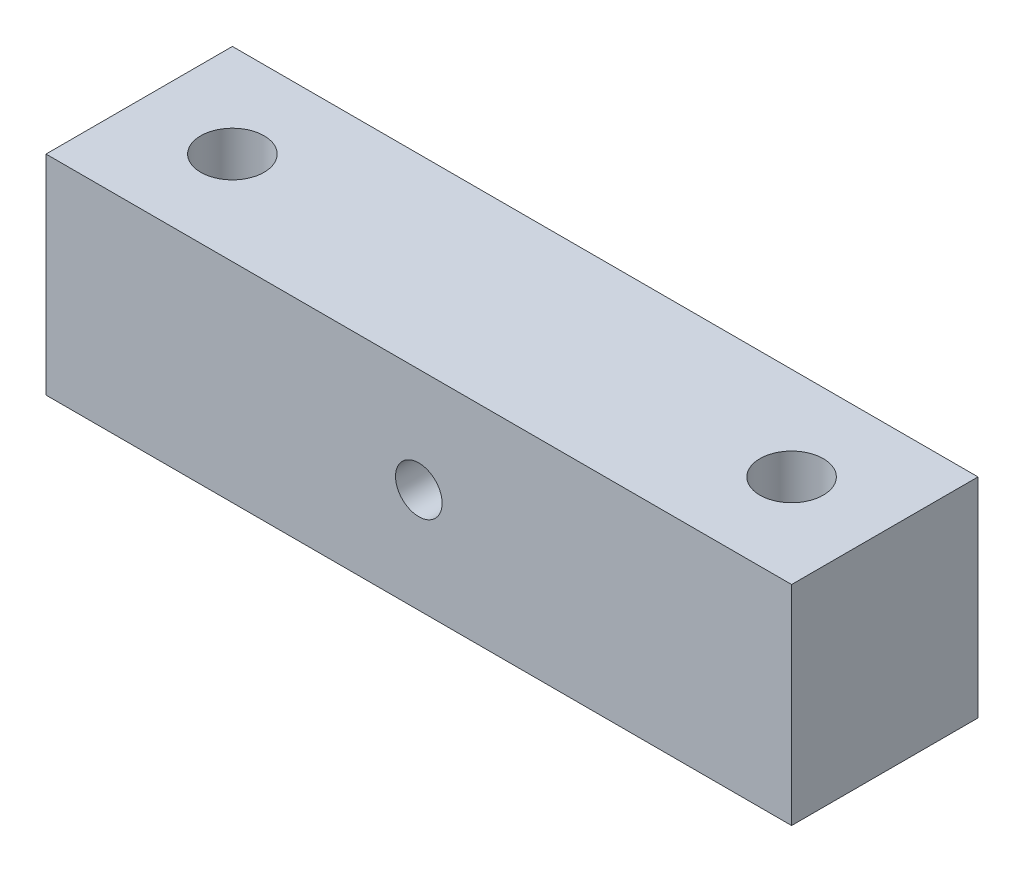
ISO-10303-21;
HEADER;
FILE_DESCRIPTION(('STEP AP214'),'2;1');
FILE_NAME('part.step','',(''),(''),'','','');
FILE_SCHEMA(('AUTOMOTIVE_DESIGN { 1 0 10303 214 1 1 1 1 }'));
ENDSEC;
DATA;
#1=APPLICATION_CONTEXT('core data for automotive mechanical design processes');
#2=APPLICATION_PROTOCOL_DEFINITION('international standard','automotive_design',2000,#1);
#3=PRODUCT_CONTEXT('',#1,'mechanical');
#4=PRODUCT('Part','Part','',(#3));
#5=PRODUCT_RELATED_PRODUCT_CATEGORY('part','',(#4));
#6=PRODUCT_DEFINITION_FORMATION('','',#4);
#7=PRODUCT_DEFINITION_CONTEXT('part definition',#1,'design');
#8=PRODUCT_DEFINITION('design','',#6,#7);
#9=PRODUCT_DEFINITION_SHAPE('','',#8);
#10=(LENGTH_UNIT() NAMED_UNIT(*) SI_UNIT(.MILLI.,.METRE.));
#11=(NAMED_UNIT(*) PLANE_ANGLE_UNIT() SI_UNIT($,.RADIAN.));
#12=(NAMED_UNIT(*) SI_UNIT($,.STERADIAN.) SOLID_ANGLE_UNIT());
#13=UNCERTAINTY_MEASURE_WITH_UNIT(LENGTH_MEASURE(1.E-05),#10,'distance_accuracy_value','');
#14=(GEOMETRIC_REPRESENTATION_CONTEXT(3) GLOBAL_UNCERTAINTY_ASSIGNED_CONTEXT((#13)) GLOBAL_UNIT_ASSIGNED_CONTEXT((#10,
#11,#12)) REPRESENTATION_CONTEXT('',''));
#15=CARTESIAN_POINT('',(0.,0.,0.));
#16=DIRECTION('',(0.,0.,1.));
#17=DIRECTION('',(1.,0.,0.));
#18=AXIS2_PLACEMENT_3D('',#15,#16,#17);
#19=CARTESIAN_POINT('',(0.,11.2,0.));
#20=DIRECTION('',(1.,0.,0.));
#21=DIRECTION('',(0.,0.,-1.));
#22=AXIS2_PLACEMENT_3D('',#19,#20,#21);
#23=PLANE('',#22);
#24=DIRECTION('',(0.,0.,1.));
#25=VECTOR('',#24,1.);
#26=CARTESIAN_POINT('',(0.,0.,0.));
#27=LINE('',#26,#25);
#28=CARTESIAN_POINT('',(0.,0.,-10.));
#29=VERTEX_POINT('',#28);
#30=CARTESIAN_POINT('',(0.,0.,0.));
#31=VERTEX_POINT('',#30);
#32=EDGE_CURVE('E97',#29,#31,#27,.T.);
#33=ORIENTED_EDGE('',*,*,#32,.T.);
#34=DIRECTION('',(0.,-1.,0.));
#35=VECTOR('',#34,1.);
#36=CARTESIAN_POINT('',(0.,11.2,0.));
#37=LINE('',#36,#35);
#38=CARTESIAN_POINT('',(0.,11.2,0.));
#39=VERTEX_POINT('',#38);
#40=EDGE_CURVE('E11',#39,#31,#37,.T.);
#41=ORIENTED_EDGE('',*,*,#40,.F.);
#42=DIRECTION('',(0.,0.,1.));
#43=VECTOR('',#42,1.);
#44=CARTESIAN_POINT('',(0.,11.2,0.));
#45=LINE('',#44,#43);
#46=CARTESIAN_POINT('',(0.,11.2,-10.));
#47=VERTEX_POINT('',#46);
#48=EDGE_CURVE('E85',#47,#39,#45,.T.);
#49=ORIENTED_EDGE('',*,*,#48,.F.);
#50=DIRECTION('',(0.,-1.,0.));
#51=VECTOR('',#50,1.);
#52=CARTESIAN_POINT('',(0.,11.2,-10.));
#53=LINE('',#52,#51);
#54=EDGE_CURVE('E93',#47,#29,#53,.T.);
#55=ORIENTED_EDGE('',*,*,#54,.T.);
#56=EDGE_LOOP('',(#33,#41,#49,#55));
#57=FACE_BOUND('',#56,.T.);
#58=ADVANCED_FACE('F34',(#57),#23,.F.);
#59=CARTESIAN_POINT('',(0.,11.2,0.));
#60=DIRECTION('',(0.,0.,-1.));
#61=DIRECTION('',(-1.,0.,0.));
#62=AXIS2_PLACEMENT_3D('',#59,#60,#61);
#63=PLANE('',#62);
#64=CARTESIAN_POINT('',(20.,5.6,0.));
#65=DIRECTION('',(0.,0.,1.));
#66=DIRECTION('',(1.,0.,0.));
#67=AXIS2_PLACEMENT_3D('',#64,#65,#66);
#68=CIRCLE('',#67,1.25);
#69=CARTESIAN_POINT('',(21.25,5.6,0.));
#70=VERTEX_POINT('',#69);
#71=EDGE_CURVE('E125',#70,#70,#68,.T.);
#72=ORIENTED_EDGE('',*,*,#71,.F.);
#73=EDGE_LOOP('',(#72));
#74=FACE_BOUND('',#73,.T.);
#75=DIRECTION('',(1.,0.,0.));
#76=VECTOR('',#75,1.);
#77=CARTESIAN_POINT('',(0.,0.,0.));
#78=LINE('',#77,#76);
#79=CARTESIAN_POINT('',(40.,0.,0.));
#80=VERTEX_POINT('',#79);
#81=EDGE_CURVE('E89',#31,#80,#78,.T.);
#82=ORIENTED_EDGE('',*,*,#81,.T.);
#83=DIRECTION('',(0.,-1.,0.));
#84=VECTOR('',#83,1.);
#85=CARTESIAN_POINT('',(40.,11.2,0.));
#86=LINE('',#85,#84);
#87=CARTESIAN_POINT('',(40.,11.2,0.));
#88=VERTEX_POINT('',#87);
#89=EDGE_CURVE('E42',#88,#80,#86,.T.);
#90=ORIENTED_EDGE('',*,*,#89,.F.);
#91=DIRECTION('',(1.,0.,0.));
#92=VECTOR('',#91,1.);
#93=CARTESIAN_POINT('',(0.,11.2,0.));
#94=LINE('',#93,#92);
#95=EDGE_CURVE('E80',#39,#88,#94,.T.);
#96=ORIENTED_EDGE('',*,*,#95,.F.);
#97=ORIENTED_EDGE('',*,*,#40,.T.);
#98=EDGE_LOOP('',(#82,#90,#96,#97));
#99=FACE_BOUND('',#98,.T.);
#100=ADVANCED_FACE('F88',(#74,#99),#63,.F.);
#101=CARTESIAN_POINT('',(40.,11.2,0.));
#102=DIRECTION('',(-1.,0.,0.));
#103=DIRECTION('',(0.,0.,1.));
#104=AXIS2_PLACEMENT_3D('',#101,#102,#103);
#105=PLANE('',#104);
#106=DIRECTION('',(0.,0.,-1.));
#107=VECTOR('',#106,1.);
#108=CARTESIAN_POINT('',(40.,0.,0.));
#109=LINE('',#108,#107);
#110=CARTESIAN_POINT('',(40.,0.,-10.));
#111=VERTEX_POINT('',#110);
#112=EDGE_CURVE('E67',#80,#111,#109,.T.);
#113=ORIENTED_EDGE('',*,*,#112,.T.);
#114=DIRECTION('',(0.,-1.,0.));
#115=VECTOR('',#114,1.);
#116=CARTESIAN_POINT('',(40.,11.2,-10.));
#117=LINE('',#116,#115);
#118=CARTESIAN_POINT('',(40.,11.2,-10.));
#119=VERTEX_POINT('',#118);
#120=EDGE_CURVE('E90',#119,#111,#117,.T.);
#121=ORIENTED_EDGE('',*,*,#120,.F.);
#122=DIRECTION('',(0.,0.,-1.));
#123=VECTOR('',#122,1.);
#124=CARTESIAN_POINT('',(40.,11.2,0.));
#125=LINE('',#124,#123);
#126=EDGE_CURVE('E83',#88,#119,#125,.T.);
#127=ORIENTED_EDGE('',*,*,#126,.F.);
#128=ORIENTED_EDGE('',*,*,#89,.T.);
#129=EDGE_LOOP('',(#113,#121,#127,#128));
#130=FACE_BOUND('',#129,.T.);
#131=ADVANCED_FACE('F91',(#130),#105,.F.);
#132=CARTESIAN_POINT('',(0.,11.2,-10.));
#133=DIRECTION('',(0.,0.,1.));
#134=DIRECTION('',(1.,0.,0.));
#135=AXIS2_PLACEMENT_3D('',#132,#133,#134);
#136=PLANE('',#135);
#137=CARTESIAN_POINT('',(20.,5.6,-10.));
#138=DIRECTION('',(0.,0.,1.));
#139=DIRECTION('',(1.,0.,0.));
#140=AXIS2_PLACEMENT_3D('',#137,#138,#139);
#141=CIRCLE('',#140,1.25);
#142=CARTESIAN_POINT('',(21.25,5.6,-10.));
#143=VERTEX_POINT('',#142);
#144=EDGE_CURVE('E122',#143,#143,#141,.T.);
#145=ORIENTED_EDGE('',*,*,#144,.T.);
#146=EDGE_LOOP('',(#145));
#147=FACE_BOUND('',#146,.T.);
#148=DIRECTION('',(-1.,0.,0.));
#149=VECTOR('',#148,1.);
#150=CARTESIAN_POINT('',(0.,0.,-10.));
#151=LINE('',#150,#149);
#152=EDGE_CURVE('E73',#111,#29,#151,.T.);
#153=ORIENTED_EDGE('',*,*,#152,.T.);
#154=ORIENTED_EDGE('',*,*,#54,.F.);
#155=DIRECTION('',(-1.,0.,0.));
#156=VECTOR('',#155,1.);
#157=CARTESIAN_POINT('',(0.,11.2,-10.));
#158=LINE('',#157,#156);
#159=EDGE_CURVE('E50',#119,#47,#158,.T.);
#160=ORIENTED_EDGE('',*,*,#159,.F.);
#161=ORIENTED_EDGE('',*,*,#120,.T.);
#162=EDGE_LOOP('',(#153,#154,#160,#161));
#163=FACE_BOUND('',#162,.T.);
#164=ADVANCED_FACE('F105',(#147,#163),#136,.F.);
#165=CARTESIAN_POINT('',(0.,11.2,0.));
#166=DIRECTION('',(0.,-1.,0.));
#167=DIRECTION('',(0.,0.,-1.));
#168=AXIS2_PLACEMENT_3D('',#165,#166,#167);
#169=PLANE('',#168);
#170=CARTESIAN_POINT('',(5.,11.2,-5.));
#171=DIRECTION('',(0.,1.,0.));
#172=DIRECTION('',(0.,0.,1.));
#173=AXIS2_PLACEMENT_3D('',#170,#171,#172);
#174=CIRCLE('',#173,1.7);
#175=CARTESIAN_POINT('',(5.,11.2,-3.3));
#176=VERTEX_POINT('',#175);
#177=EDGE_CURVE('E119',#176,#176,#174,.T.);
#178=ORIENTED_EDGE('',*,*,#177,.F.);
#179=EDGE_LOOP('',(#178));
#180=FACE_BOUND('',#179,.T.);
#181=CARTESIAN_POINT('',(35.,11.2,-5.));
#182=DIRECTION('',(0.,1.,0.));
#183=DIRECTION('',(0.,0.,1.));
#184=AXIS2_PLACEMENT_3D('',#181,#182,#183);
#185=CIRCLE('',#184,1.7);
#186=CARTESIAN_POINT('',(35.,11.2,-3.3));
#187=VERTEX_POINT('',#186);
#188=EDGE_CURVE('E113',#187,#187,#185,.T.);
#189=ORIENTED_EDGE('',*,*,#188,.F.);
#190=EDGE_LOOP('',(#189));
#191=FACE_BOUND('',#190,.T.);
#192=ORIENTED_EDGE('',*,*,#48,.T.);
#193=ORIENTED_EDGE('',*,*,#95,.T.);
#194=ORIENTED_EDGE('',*,*,#126,.T.);
#195=ORIENTED_EDGE('',*,*,#159,.T.);
#196=EDGE_LOOP('',(#192,#193,#194,#195));
#197=FACE_BOUND('',#196,.T.);
#198=ADVANCED_FACE('F81',(#180,#191,#197),#169,.F.);
#199=CARTESIAN_POINT('',(0.,0.,0.));
#200=DIRECTION('',(0.,-1.,0.));
#201=DIRECTION('',(0.,0.,-1.));
#202=AXIS2_PLACEMENT_3D('',#199,#200,#201);
#203=PLANE('',#202);
#204=CARTESIAN_POINT('',(5.,0.,-5.));
#205=DIRECTION('',(0.,1.,0.));
#206=DIRECTION('',(0.,0.,1.));
#207=AXIS2_PLACEMENT_3D('',#204,#205,#206);
#208=CIRCLE('',#207,1.7);
#209=CARTESIAN_POINT('',(5.,0.,-3.3));
#210=VERTEX_POINT('',#209);
#211=EDGE_CURVE('E116',#210,#210,#208,.T.);
#212=ORIENTED_EDGE('',*,*,#211,.T.);
#213=EDGE_LOOP('',(#212));
#214=FACE_BOUND('',#213,.T.);
#215=CARTESIAN_POINT('',(35.,0.,-5.));
#216=DIRECTION('',(0.,1.,0.));
#217=DIRECTION('',(0.,0.,1.));
#218=AXIS2_PLACEMENT_3D('',#215,#216,#217);
#219=CIRCLE('',#218,1.7);
#220=CARTESIAN_POINT('',(35.,0.,-3.3));
#221=VERTEX_POINT('',#220);
#222=EDGE_CURVE('E100',#221,#221,#219,.T.);
#223=ORIENTED_EDGE('',*,*,#222,.T.);
#224=EDGE_LOOP('',(#223));
#225=FACE_BOUND('',#224,.T.);
#226=ORIENTED_EDGE('',*,*,#32,.F.);
#227=ORIENTED_EDGE('',*,*,#152,.F.);
#228=ORIENTED_EDGE('',*,*,#112,.F.);
#229=ORIENTED_EDGE('',*,*,#81,.F.);
#230=EDGE_LOOP('',(#226,#227,#228,#229));
#231=FACE_BOUND('',#230,.T.);
#232=ADVANCED_FACE('F108',(#214,#225,#231),#203,.T.);
#233=CARTESIAN_POINT('',(35.,11.2,-5.));
#234=DIRECTION('',(0.,1.,0.));
#235=DIRECTION('',(0.,0.,1.));
#236=AXIS2_PLACEMENT_3D('',#233,#234,#235);
#237=CYLINDRICAL_SURFACE('',#236,1.7);
#238=ORIENTED_EDGE('',*,*,#222,.F.);
#239=EDGE_LOOP('',(#238));
#240=FACE_BOUND('',#239,.T.);
#241=ORIENTED_EDGE('',*,*,#188,.T.);
#242=EDGE_LOOP('',(#241));
#243=FACE_BOUND('',#242,.T.);
#244=ADVANCED_FACE('F143',(#240,#243),#237,.F.);
#245=CARTESIAN_POINT('',(5.,11.2,-5.));
#246=DIRECTION('',(0.,1.,0.));
#247=DIRECTION('',(0.,0.,1.));
#248=AXIS2_PLACEMENT_3D('',#245,#246,#247);
#249=CYLINDRICAL_SURFACE('',#248,1.7);
#250=ORIENTED_EDGE('',*,*,#211,.F.);
#251=EDGE_LOOP('',(#250));
#252=FACE_BOUND('',#251,.T.);
#253=ORIENTED_EDGE('',*,*,#177,.T.);
#254=EDGE_LOOP('',(#253));
#255=FACE_BOUND('',#254,.T.);
#256=ADVANCED_FACE('F150',(#252,#255),#249,.F.);
#257=CARTESIAN_POINT('',(20.,5.6,0.));
#258=DIRECTION('',(0.,0.,1.));
#259=DIRECTION('',(1.,0.,0.));
#260=AXIS2_PLACEMENT_3D('',#257,#258,#259);
#261=CYLINDRICAL_SURFACE('',#260,1.25);
#262=ORIENTED_EDGE('',*,*,#144,.F.);
#263=EDGE_LOOP('',(#262));
#264=FACE_BOUND('',#263,.T.);
#265=ORIENTED_EDGE('',*,*,#71,.T.);
#266=EDGE_LOOP('',(#265));
#267=FACE_BOUND('',#266,.T.);
#268=ADVANCED_FACE('F129',(#264,#267),#261,.F.);
#269=CLOSED_SHELL('',(#58,#100,#131,#164,#198,#232,#244,#256,#268));
#270=MANIFOLD_SOLID_BREP('B2',#269);
#271=ADVANCED_BREP_SHAPE_REPRESENTATION('',(#18,#270),#14);
#272=SHAPE_DEFINITION_REPRESENTATION(#9,#271);
ENDSEC;
END-ISO-10303-21;
